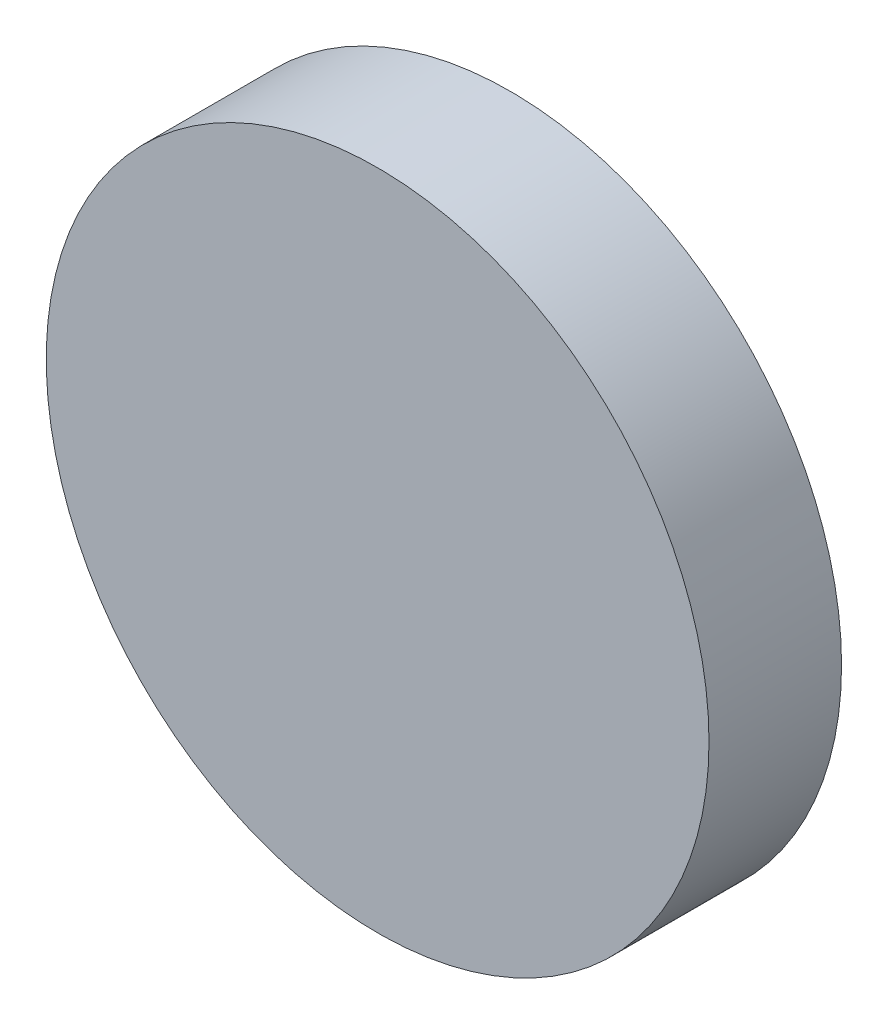
ISO-10303-21;
HEADER;
FILE_DESCRIPTION(('STEP AP214'),'2;1');
FILE_NAME('part.step','',(''),(''),'','','');
FILE_SCHEMA(('AUTOMOTIVE_DESIGN { 1 0 10303 214 1 1 1 1 }'));
ENDSEC;
DATA;
#1=APPLICATION_CONTEXT('core data for automotive mechanical design processes');
#2=APPLICATION_PROTOCOL_DEFINITION('international standard','automotive_design',2000,#1);
#3=PRODUCT_CONTEXT('',#1,'mechanical');
#4=PRODUCT('Part','Part','',(#3));
#5=PRODUCT_RELATED_PRODUCT_CATEGORY('part','',(#4));
#6=PRODUCT_DEFINITION_FORMATION('','',#4);
#7=PRODUCT_DEFINITION_CONTEXT('part definition',#1,'design');
#8=PRODUCT_DEFINITION('design','',#6,#7);
#9=PRODUCT_DEFINITION_SHAPE('','',#8);
#10=(LENGTH_UNIT() NAMED_UNIT(*) SI_UNIT(.MILLI.,.METRE.));
#11=(NAMED_UNIT(*) PLANE_ANGLE_UNIT() SI_UNIT($,.RADIAN.));
#12=(NAMED_UNIT(*) SI_UNIT($,.STERADIAN.) SOLID_ANGLE_UNIT());
#13=UNCERTAINTY_MEASURE_WITH_UNIT(LENGTH_MEASURE(1.E-05),#10,'distance_accuracy_value','');
#14=(GEOMETRIC_REPRESENTATION_CONTEXT(3) GLOBAL_UNCERTAINTY_ASSIGNED_CONTEXT((#13)) GLOBAL_UNIT_ASSIGNED_CONTEXT((#10,
#11,#12)) REPRESENTATION_CONTEXT('',''));
#15=CARTESIAN_POINT('',(0.,0.,0.));
#16=DIRECTION('',(0.,0.,1.));
#17=DIRECTION('',(1.,0.,0.));
#18=AXIS2_PLACEMENT_3D('',#15,#16,#17);
#19=CARTESIAN_POINT('',(0.,0.,6.));
#20=DIRECTION('',(0.,0.,-1.));
#21=DIRECTION('',(-1.,0.,0.));
#22=AXIS2_PLACEMENT_3D('',#19,#20,#21);
#23=CYLINDRICAL_SURFACE('',#22,15.);
#24=CARTESIAN_POINT('',(0.,0.,6.));
#25=DIRECTION('',(0.,0.,1.));
#26=DIRECTION('',(1.,0.,0.));
#27=AXIS2_PLACEMENT_3D('',#24,#25,#26);
#28=CIRCLE('',#27,15.);
#29=CARTESIAN_POINT('',(15.,0.,6.));
#30=VERTEX_POINT('',#29);
#31=EDGE_CURVE('E10',#30,#30,#28,.T.);
#32=ORIENTED_EDGE('',*,*,#31,.F.);
#33=EDGE_LOOP('',(#32));
#34=FACE_BOUND('',#33,.T.);
#35=CARTESIAN_POINT('',(0.,0.,0.));
#36=DIRECTION('',(0.,0.,1.));
#37=DIRECTION('',(1.,0.,0.));
#38=AXIS2_PLACEMENT_3D('',#35,#36,#37);
#39=CIRCLE('',#38,15.);
#40=CARTESIAN_POINT('',(15.,0.,0.));
#41=VERTEX_POINT('',#40);
#42=EDGE_CURVE('E46',#41,#41,#39,.T.);
#43=ORIENTED_EDGE('',*,*,#42,.T.);
#44=EDGE_LOOP('',(#43));
#45=FACE_BOUND('',#44,.T.);
#46=ADVANCED_FACE('F43',(#34,#45),#23,.T.);
#47=CARTESIAN_POINT('',(0.,0.,6.));
#48=DIRECTION('',(0.,0.,1.));
#49=DIRECTION('',(1.,0.,0.));
#50=AXIS2_PLACEMENT_3D('',#47,#48,#49);
#51=PLANE('',#50);
#52=ORIENTED_EDGE('',*,*,#31,.T.);
#53=EDGE_LOOP('',(#52));
#54=FACE_BOUND('',#53,.T.);
#55=ADVANCED_FACE('F60',(#54),#51,.T.);
#56=CARTESIAN_POINT('',(0.,0.,0.));
#57=DIRECTION('',(0.,0.,1.));
#58=DIRECTION('',(1.,0.,0.));
#59=AXIS2_PLACEMENT_3D('',#56,#57,#58);
#60=PLANE('',#59);
#61=ORIENTED_EDGE('',*,*,#42,.F.);
#62=EDGE_LOOP('',(#61));
#63=FACE_BOUND('',#62,.T.);
#64=ADVANCED_FACE('F58',(#63),#60,.F.);
#65=CLOSED_SHELL('',(#46,#55,#64));
#66=MANIFOLD_SOLID_BREP('B2',#65);
#67=ADVANCED_BREP_SHAPE_REPRESENTATION('',(#18,#66),#14);
#68=SHAPE_DEFINITION_REPRESENTATION(#9,#67);
ENDSEC;
END-ISO-10303-21;
